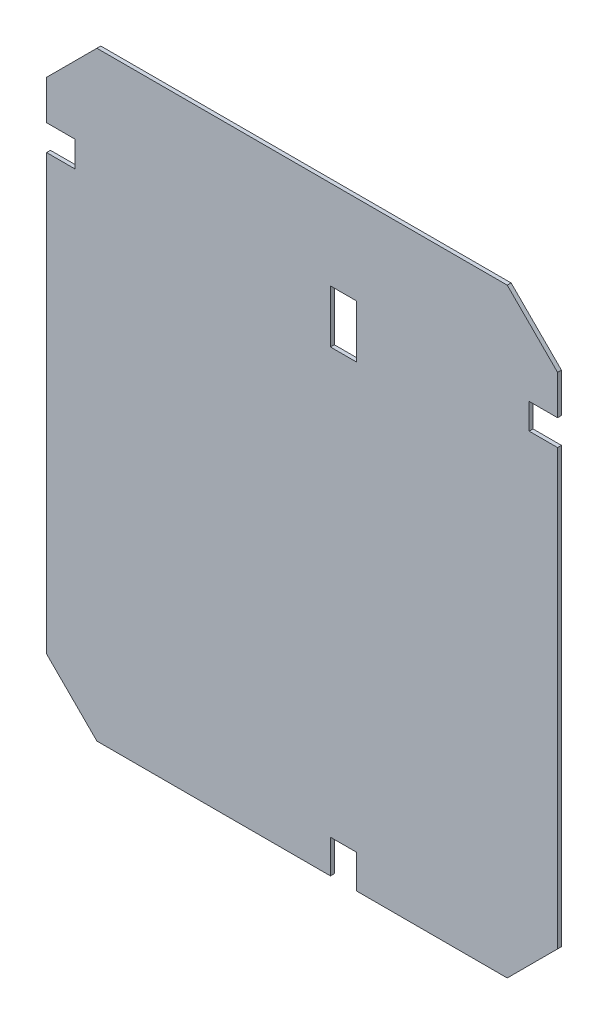
ISO-10303-21;
HEADER;
FILE_DESCRIPTION(('STEP AP214'),'2;1');
FILE_NAME('part.step','',(''),(''),'','','');
FILE_SCHEMA(('AUTOMOTIVE_DESIGN { 1 0 10303 214 1 1 1 1 }'));
ENDSEC;
DATA;
#1=APPLICATION_CONTEXT('core data for automotive mechanical design processes');
#2=APPLICATION_PROTOCOL_DEFINITION('international standard','automotive_design',2000,#1);
#3=PRODUCT_CONTEXT('',#1,'mechanical');
#4=PRODUCT('Part','Part','',(#3));
#5=PRODUCT_RELATED_PRODUCT_CATEGORY('part','',(#4));
#6=PRODUCT_DEFINITION_FORMATION('','',#4);
#7=PRODUCT_DEFINITION_CONTEXT('part definition',#1,'design');
#8=PRODUCT_DEFINITION('design','',#6,#7);
#9=PRODUCT_DEFINITION_SHAPE('','',#8);
#10=(LENGTH_UNIT() NAMED_UNIT(*) SI_UNIT(.MILLI.,.METRE.));
#11=(NAMED_UNIT(*) PLANE_ANGLE_UNIT() SI_UNIT($,.RADIAN.));
#12=(NAMED_UNIT(*) SI_UNIT($,.STERADIAN.) SOLID_ANGLE_UNIT());
#13=UNCERTAINTY_MEASURE_WITH_UNIT(LENGTH_MEASURE(1.E-05),#10,'distance_accuracy_value','');
#14=(GEOMETRIC_REPRESENTATION_CONTEXT(3) GLOBAL_UNCERTAINTY_ASSIGNED_CONTEXT((#13)) GLOBAL_UNIT_ASSIGNED_CONTEXT((#10,
#11,#12)) REPRESENTATION_CONTEXT('',''));
#15=CARTESIAN_POINT('',(0.,0.,0.));
#16=DIRECTION('',(0.,0.,1.));
#17=DIRECTION('',(1.,0.,0.));
#18=AXIS2_PLACEMENT_3D('',#15,#16,#17);
#19=CARTESIAN_POINT('',(-198.,-232.5,3.));
#20=DIRECTION('',(1.,0.,0.));
#21=DIRECTION('',(0.,1.,0.));
#22=AXIS2_PLACEMENT_3D('',#19,#20,#21);
#23=PLANE('',#22);
#24=DIRECTION('',(0.,0.,-1.));
#25=VECTOR('',#24,1.);
#26=CARTESIAN_POINT('',(-198.,143.,3.));
#27=LINE('',#26,#25);
#28=CARTESIAN_POINT('',(-198.,143.,3.));
#29=VERTEX_POINT('',#28);
#30=CARTESIAN_POINT('',(-198.,143.,0.));
#31=VERTEX_POINT('',#30);
#32=EDGE_CURVE('E303',#29,#31,#27,.T.);
#33=ORIENTED_EDGE('',*,*,#32,.T.);
#34=DIRECTION('',(0.,-1.,0.));
#35=VECTOR('',#34,1.);
#36=CARTESIAN_POINT('',(-198.,-232.5,0.));
#37=LINE('',#36,#35);
#38=CARTESIAN_POINT('',(-198.,-193.5,0.));
#39=VERTEX_POINT('',#38);
#40=EDGE_CURVE('E223',#31,#39,#37,.T.);
#41=ORIENTED_EDGE('',*,*,#40,.T.);
#42=DIRECTION('',(0.,0.,1.));
#43=VECTOR('',#42,1.);
#44=CARTESIAN_POINT('',(-198.,-193.5,3.));
#45=LINE('',#44,#43);
#46=CARTESIAN_POINT('',(-198.,-193.5,3.));
#47=VERTEX_POINT('',#46);
#48=EDGE_CURVE('E11',#39,#47,#45,.T.);
#49=ORIENTED_EDGE('',*,*,#48,.T.);
#50=DIRECTION('',(0.,-1.,0.));
#51=VECTOR('',#50,1.);
#52=CARTESIAN_POINT('',(-198.,-232.5,3.));
#53=LINE('',#52,#51);
#54=EDGE_CURVE('E232',#29,#47,#53,.T.);
#55=ORIENTED_EDGE('',*,*,#54,.F.);
#56=EDGE_LOOP('',(#33,#41,#49,#55));
#57=FACE_BOUND('',#56,.T.);
#58=ADVANCED_FACE('F17',(#57),#23,.F.);
#59=DIRECTION('',(0.,0.,-1.));
#60=VECTOR('',#59,1.);
#61=CARTESIAN_POINT('',(-198.,163.,3.));
#62=LINE('',#61,#60);
#63=CARTESIAN_POINT('',(-198.,163.,3.));
#64=VERTEX_POINT('',#63);
#65=CARTESIAN_POINT('',(-198.,163.,0.));
#66=VERTEX_POINT('',#65);
#67=EDGE_CURVE('E296',#64,#66,#62,.T.);
#68=ORIENTED_EDGE('',*,*,#67,.F.);
#69=CARTESIAN_POINT('',(-198.,193.5,3.));
#70=VERTEX_POINT('',#69);
#71=EDGE_CURVE('E210',#70,#64,#53,.T.);
#72=ORIENTED_EDGE('',*,*,#71,.F.);
#73=DIRECTION('',(0.,0.,-1.));
#74=VECTOR('',#73,1.);
#75=CARTESIAN_POINT('',(-198.,193.5,3.));
#76=LINE('',#75,#74);
#77=CARTESIAN_POINT('',(-198.,193.5,0.));
#78=VERTEX_POINT('',#77);
#79=EDGE_CURVE('E26',#70,#78,#76,.T.);
#80=ORIENTED_EDGE('',*,*,#79,.T.);
#81=EDGE_CURVE('E219',#78,#66,#37,.T.);
#82=ORIENTED_EDGE('',*,*,#81,.T.);
#83=EDGE_LOOP('',(#68,#72,#80,#82));
#84=FACE_BOUND('',#83,.T.);
#85=ADVANCED_FACE('F271',(#84),#23,.F.);
#86=CARTESIAN_POINT('',(198.,-232.5,3.));
#87=DIRECTION('',(0.,1.,0.));
#88=DIRECTION('',(-1.,0.,0.));
#89=AXIS2_PLACEMENT_3D('',#86,#87,#88);
#90=PLANE('',#89);
#91=DIRECTION('',(0.,0.,-1.));
#92=VECTOR('',#91,1.);
#93=CARTESIAN_POINT('',(22.,-232.5,3.));
#94=LINE('',#93,#92);
#95=CARTESIAN_POINT('',(22.,-232.5,3.));
#96=VERTEX_POINT('',#95);
#97=CARTESIAN_POINT('',(22.,-232.5,0.));
#98=VERTEX_POINT('',#97);
#99=EDGE_CURVE('E181',#96,#98,#94,.T.);
#100=ORIENTED_EDGE('',*,*,#99,.F.);
#101=DIRECTION('',(1.,0.,0.));
#102=VECTOR('',#101,1.);
#103=CARTESIAN_POINT('',(198.,-232.5,3.));
#104=LINE('',#103,#102);
#105=CARTESIAN_POINT('',(-159.,-232.5,3.));
#106=VERTEX_POINT('',#105);
#107=EDGE_CURVE('E194',#106,#96,#104,.T.);
#108=ORIENTED_EDGE('',*,*,#107,.F.);
#109=DIRECTION('',(0.,0.,-1.));
#110=VECTOR('',#109,1.);
#111=CARTESIAN_POINT('',(-159.,-232.5,3.));
#112=LINE('',#111,#110);
#113=CARTESIAN_POINT('',(-159.,-232.5,0.));
#114=VERTEX_POINT('',#113);
#115=EDGE_CURVE('E249',#106,#114,#112,.T.);
#116=ORIENTED_EDGE('',*,*,#115,.T.);
#117=DIRECTION('',(1.,0.,0.));
#118=VECTOR('',#117,1.);
#119=CARTESIAN_POINT('',(198.,-232.5,0.));
#120=LINE('',#119,#118);
#121=EDGE_CURVE('E197',#114,#98,#120,.T.);
#122=ORIENTED_EDGE('',*,*,#121,.T.);
#123=EDGE_LOOP('',(#100,#108,#116,#122));
#124=FACE_BOUND('',#123,.T.);
#125=ADVANCED_FACE('F192',(#124),#90,.F.);
#126=DIRECTION('',(0.,0.,-1.));
#127=VECTOR('',#126,1.);
#128=CARTESIAN_POINT('',(42.,-232.5,3.));
#129=LINE('',#128,#127);
#130=CARTESIAN_POINT('',(42.,-232.5,3.));
#131=VERTEX_POINT('',#130);
#132=CARTESIAN_POINT('',(42.,-232.5,0.));
#133=VERTEX_POINT('',#132);
#134=EDGE_CURVE('E199',#131,#133,#129,.T.);
#135=ORIENTED_EDGE('',*,*,#134,.T.);
#136=CARTESIAN_POINT('',(159.,-232.5,0.));
#137=VERTEX_POINT('',#136);
#138=EDGE_CURVE('E222',#133,#137,#120,.T.);
#139=ORIENTED_EDGE('',*,*,#138,.T.);
#140=DIRECTION('',(0.,0.,1.));
#141=VECTOR('',#140,1.);
#142=CARTESIAN_POINT('',(159.,-232.5,3.));
#143=LINE('',#142,#141);
#144=CARTESIAN_POINT('',(159.,-232.5,3.));
#145=VERTEX_POINT('',#144);
#146=EDGE_CURVE('E251',#137,#145,#143,.T.);
#147=ORIENTED_EDGE('',*,*,#146,.T.);
#148=EDGE_CURVE('E206',#131,#145,#104,.T.);
#149=ORIENTED_EDGE('',*,*,#148,.F.);
#150=EDGE_LOOP('',(#135,#139,#147,#149));
#151=FACE_BOUND('',#150,.T.);
#152=ADVANCED_FACE('F470',(#151),#90,.F.);
#153=CARTESIAN_POINT('',(198.,-232.5,3.));
#154=DIRECTION('',(-1.,0.,0.));
#155=DIRECTION('',(0.,0.,1.));
#156=AXIS2_PLACEMENT_3D('',#153,#154,#155);
#157=PLANE('',#156);
#158=DIRECTION('',(0.,0.,-1.));
#159=VECTOR('',#158,1.);
#160=CARTESIAN_POINT('',(198.,163.,3.));
#161=LINE('',#160,#159);
#162=CARTESIAN_POINT('',(198.,163.,3.));
#163=VERTEX_POINT('',#162);
#164=CARTESIAN_POINT('',(198.,163.,0.));
#165=VERTEX_POINT('',#164);
#166=EDGE_CURVE('E313',#163,#165,#161,.T.);
#167=ORIENTED_EDGE('',*,*,#166,.T.);
#168=DIRECTION('',(0.,1.,0.));
#169=VECTOR('',#168,1.);
#170=CARTESIAN_POINT('',(198.,-232.5,0.));
#171=LINE('',#170,#169);
#172=CARTESIAN_POINT('',(198.,193.5,0.));
#173=VERTEX_POINT('',#172);
#174=EDGE_CURVE('E225',#165,#173,#171,.T.);
#175=ORIENTED_EDGE('',*,*,#174,.T.);
#176=DIRECTION('',(0.,0.,1.));
#177=VECTOR('',#176,1.);
#178=CARTESIAN_POINT('',(198.,193.5,3.));
#179=LINE('',#178,#177);
#180=CARTESIAN_POINT('',(198.,193.5,3.));
#181=VERTEX_POINT('',#180);
#182=EDGE_CURVE('E218',#173,#181,#179,.T.);
#183=ORIENTED_EDGE('',*,*,#182,.T.);
#184=DIRECTION('',(0.,1.,0.));
#185=VECTOR('',#184,1.);
#186=CARTESIAN_POINT('',(198.,-232.5,3.));
#187=LINE('',#186,#185);
#188=EDGE_CURVE('E205',#163,#181,#187,.T.);
#189=ORIENTED_EDGE('',*,*,#188,.F.);
#190=EDGE_LOOP('',(#167,#175,#183,#189));
#191=FACE_BOUND('',#190,.T.);
#192=ADVANCED_FACE('F432',(#191),#157,.F.);
#193=DIRECTION('',(0.,0.,-1.));
#194=VECTOR('',#193,1.);
#195=CARTESIAN_POINT('',(198.,143.,3.));
#196=LINE('',#195,#194);
#197=CARTESIAN_POINT('',(198.,143.,3.));
#198=VERTEX_POINT('',#197);
#199=CARTESIAN_POINT('',(198.,143.,0.));
#200=VERTEX_POINT('',#199);
#201=EDGE_CURVE('E323',#198,#200,#196,.T.);
#202=ORIENTED_EDGE('',*,*,#201,.F.);
#203=CARTESIAN_POINT('',(198.,-193.5,3.));
#204=VERTEX_POINT('',#203);
#205=EDGE_CURVE('E208',#204,#198,#187,.T.);
#206=ORIENTED_EDGE('',*,*,#205,.F.);
#207=DIRECTION('',(0.,0.,-1.));
#208=VECTOR('',#207,1.);
#209=CARTESIAN_POINT('',(198.,-193.5,3.));
#210=LINE('',#209,#208);
#211=CARTESIAN_POINT('',(198.,-193.5,0.));
#212=VERTEX_POINT('',#211);
#213=EDGE_CURVE('E235',#204,#212,#210,.T.);
#214=ORIENTED_EDGE('',*,*,#213,.T.);
#215=EDGE_CURVE('E226',#212,#200,#171,.T.);
#216=ORIENTED_EDGE('',*,*,#215,.T.);
#217=EDGE_LOOP('',(#202,#206,#214,#216));
#218=FACE_BOUND('',#217,.T.);
#219=ADVANCED_FACE('F417',(#218),#157,.F.);
#220=CARTESIAN_POINT('',(0.,0.,3.));
#221=DIRECTION('',(0.,0.,1.));
#222=DIRECTION('',(1.,0.,0.));
#223=AXIS2_PLACEMENT_3D('',#220,#221,#222);
#224=PLANE('',#223);
#225=DIRECTION('',(1.,0.,0.));
#226=VECTOR('',#225,1.);
#227=CARTESIAN_POINT('',(22.,122.5,3.));
#228=LINE('',#227,#226);
#229=CARTESIAN_POINT('',(22.,122.5,3.));
#230=VERTEX_POINT('',#229);
#231=CARTESIAN_POINT('',(42.,122.5,3.));
#232=VERTEX_POINT('',#231);
#233=EDGE_CURVE('E332',#230,#232,#228,.T.);
#234=ORIENTED_EDGE('',*,*,#233,.F.);
#235=DIRECTION('',(0.,-1.,0.));
#236=VECTOR('',#235,1.);
#237=CARTESIAN_POINT('',(22.,163.5,3.));
#238=LINE('',#237,#236);
#239=CARTESIAN_POINT('',(22.,163.5,3.));
#240=VERTEX_POINT('',#239);
#241=EDGE_CURVE('E330',#240,#230,#238,.T.);
#242=ORIENTED_EDGE('',*,*,#241,.F.);
#243=DIRECTION('',(-1.,0.,0.));
#244=VECTOR('',#243,1.);
#245=CARTESIAN_POINT('',(22.,163.5,3.));
#246=LINE('',#245,#244);
#247=CARTESIAN_POINT('',(42.,163.5,3.));
#248=VERTEX_POINT('',#247);
#249=EDGE_CURVE('E337',#248,#240,#246,.T.);
#250=ORIENTED_EDGE('',*,*,#249,.F.);
#251=DIRECTION('',(0.,1.,0.));
#252=VECTOR('',#251,1.);
#253=CARTESIAN_POINT('',(42.,163.5,3.));
#254=LINE('',#253,#252);
#255=EDGE_CURVE('E335',#232,#248,#254,.T.);
#256=ORIENTED_EDGE('',*,*,#255,.F.);
#257=EDGE_LOOP('',(#234,#242,#250,#256));
#258=FACE_BOUND('',#257,.T.);
#259=DIRECTION('',(0.,-1.,0.));
#260=VECTOR('',#259,1.);
#261=CARTESIAN_POINT('',(176.,163.,3.));
#262=LINE('',#261,#260);
#263=CARTESIAN_POINT('',(176.,163.,3.));
#264=VERTEX_POINT('',#263);
#265=CARTESIAN_POINT('',(176.,143.,3.));
#266=VERTEX_POINT('',#265);
#267=EDGE_CURVE('E308',#264,#266,#262,.T.);
#268=ORIENTED_EDGE('',*,*,#267,.F.);
#269=DIRECTION('',(-1.,0.,0.));
#270=VECTOR('',#269,1.);
#271=CARTESIAN_POINT('',(198.,163.,3.));
#272=LINE('',#271,#270);
#273=EDGE_CURVE('E306',#163,#264,#272,.T.);
#274=ORIENTED_EDGE('',*,*,#273,.F.);
#275=ORIENTED_EDGE('',*,*,#188,.T.);
#276=DIRECTION('',(0.707106781186546,-0.707106781186549,0.));
#277=VECTOR('',#276,1.);
#278=CARTESIAN_POINT('',(195.75,195.75,3.));
#279=LINE('',#278,#277);
#280=CARTESIAN_POINT('',(159.,232.5,3.));
#281=VERTEX_POINT('',#280);
#282=EDGE_CURVE('E257',#181,#281,#279,.F.);
#283=ORIENTED_EDGE('',*,*,#282,.T.);
#284=DIRECTION('',(-1.,0.,0.));
#285=VECTOR('',#284,1.);
#286=CARTESIAN_POINT('',(198.,232.5,3.));
#287=LINE('',#286,#285);
#288=CARTESIAN_POINT('',(-159.,232.5,3.));
#289=VERTEX_POINT('',#288);
#290=EDGE_CURVE('E215',#281,#289,#287,.T.);
#291=ORIENTED_EDGE('',*,*,#290,.T.);
#292=DIRECTION('',(0.707106781186549,0.707106781186546,0.));
#293=VECTOR('',#292,1.);
#294=CARTESIAN_POINT('',(-195.75,195.75,3.));
#295=LINE('',#294,#293);
#296=EDGE_CURVE('E254',#289,#70,#295,.F.);
#297=ORIENTED_EDGE('',*,*,#296,.T.);
#298=ORIENTED_EDGE('',*,*,#71,.T.);
#299=DIRECTION('',(-1.,0.,0.));
#300=VECTOR('',#299,1.);
#301=CARTESIAN_POINT('',(-198.,163.,3.));
#302=LINE('',#301,#300);
#303=CARTESIAN_POINT('',(-176.,163.,3.));
#304=VERTEX_POINT('',#303);
#305=EDGE_CURVE('E299',#304,#64,#302,.T.);
#306=ORIENTED_EDGE('',*,*,#305,.F.);
#307=DIRECTION('',(0.,1.,0.));
#308=VECTOR('',#307,1.);
#309=CARTESIAN_POINT('',(-176.,163.,3.));
#310=LINE('',#309,#308);
#311=CARTESIAN_POINT('',(-176.,143.,3.));
#312=VERTEX_POINT('',#311);
#313=EDGE_CURVE('E290',#312,#304,#310,.T.);
#314=ORIENTED_EDGE('',*,*,#313,.F.);
#315=DIRECTION('',(1.,0.,0.));
#316=VECTOR('',#315,1.);
#317=CARTESIAN_POINT('',(-198.,143.,3.));
#318=LINE('',#317,#316);
#319=EDGE_CURVE('E288',#29,#312,#318,.T.);
#320=ORIENTED_EDGE('',*,*,#319,.F.);
#321=ORIENTED_EDGE('',*,*,#54,.T.);
#322=DIRECTION('',(-0.707106781186546,0.707106781186549,0.));
#323=VECTOR('',#322,1.);
#324=CARTESIAN_POINT('',(-195.75,-195.75,3.));
#325=LINE('',#324,#323);
#326=EDGE_CURVE('E204',#47,#106,#325,.F.);
#327=ORIENTED_EDGE('',*,*,#326,.T.);
#328=ORIENTED_EDGE('',*,*,#107,.T.);
#329=DIRECTION('',(0.,-1.,0.));
#330=VECTOR('',#329,1.);
#331=CARTESIAN_POINT('',(22.,-232.5,3.));
#332=LINE('',#331,#330);
#333=CARTESIAN_POINT('',(22.,-206.5,3.));
#334=VERTEX_POINT('',#333);
#335=EDGE_CURVE('E178',#334,#96,#332,.T.);
#336=ORIENTED_EDGE('',*,*,#335,.F.);
#337=DIRECTION('',(-1.,0.,0.));
#338=VECTOR('',#337,1.);
#339=CARTESIAN_POINT('',(22.,-206.5,3.));
#340=LINE('',#339,#338);
#341=CARTESIAN_POINT('',(42.,-206.5,3.));
#342=VERTEX_POINT('',#341);
#343=EDGE_CURVE('E454',#342,#334,#340,.T.);
#344=ORIENTED_EDGE('',*,*,#343,.F.);
#345=DIRECTION('',(0.,1.,0.));
#346=VECTOR('',#345,1.);
#347=CARTESIAN_POINT('',(42.,-232.5,3.));
#348=LINE('',#347,#346);
#349=EDGE_CURVE('E186',#131,#342,#348,.T.);
#350=ORIENTED_EDGE('',*,*,#349,.F.);
#351=ORIENTED_EDGE('',*,*,#148,.T.);
#352=DIRECTION('',(-0.707106781186549,-0.707106781186546,0.));
#353=VECTOR('',#352,1.);
#354=CARTESIAN_POINT('',(195.75,-195.75,3.));
#355=LINE('',#354,#353);
#356=EDGE_CURVE('E259',#145,#204,#355,.F.);
#357=ORIENTED_EDGE('',*,*,#356,.T.);
#358=ORIENTED_EDGE('',*,*,#205,.T.);
#359=DIRECTION('',(1.,0.,0.));
#360=VECTOR('',#359,1.);
#361=CARTESIAN_POINT('',(198.,143.,3.));
#362=LINE('',#361,#360);
#363=EDGE_CURVE('E311',#266,#198,#362,.T.);
#364=ORIENTED_EDGE('',*,*,#363,.F.);
#365=EDGE_LOOP('',(#268,#274,#275,#283,#291,#297,#298,#306,#314,#320,#321,#327,#328,#336,#344,
#350,#351,#357,#358,#364));
#366=FACE_BOUND('',#365,.T.);
#367=ADVANCED_FACE('F202',(#258,#366),#224,.T.);
#368=CARTESIAN_POINT('',(0.,0.,0.));
#369=DIRECTION('',(0.,0.,1.));
#370=DIRECTION('',(1.,0.,0.));
#371=AXIS2_PLACEMENT_3D('',#368,#369,#370);
#372=PLANE('',#371);
#373=DIRECTION('',(0.,-1.,0.));
#374=VECTOR('',#373,1.);
#375=CARTESIAN_POINT('',(22.,163.5,0.));
#376=LINE('',#375,#374);
#377=CARTESIAN_POINT('',(22.,163.5,0.));
#378=VERTEX_POINT('',#377);
#379=CARTESIAN_POINT('',(22.,122.5,0.));
#380=VERTEX_POINT('',#379);
#381=EDGE_CURVE('E198',#378,#380,#376,.T.);
#382=ORIENTED_EDGE('',*,*,#381,.T.);
#383=DIRECTION('',(1.,0.,0.));
#384=VECTOR('',#383,1.);
#385=CARTESIAN_POINT('',(22.,122.5,0.));
#386=LINE('',#385,#384);
#387=CARTESIAN_POINT('',(42.,122.5,0.));
#388=VERTEX_POINT('',#387);
#389=EDGE_CURVE('E342',#380,#388,#386,.T.);
#390=ORIENTED_EDGE('',*,*,#389,.T.);
#391=DIRECTION('',(0.,1.,0.));
#392=VECTOR('',#391,1.);
#393=CARTESIAN_POINT('',(42.,163.5,0.));
#394=LINE('',#393,#392);
#395=CARTESIAN_POINT('',(42.,163.5,0.));
#396=VERTEX_POINT('',#395);
#397=EDGE_CURVE('E345',#388,#396,#394,.T.);
#398=ORIENTED_EDGE('',*,*,#397,.T.);
#399=DIRECTION('',(-1.,0.,0.));
#400=VECTOR('',#399,1.);
#401=CARTESIAN_POINT('',(22.,163.5,0.));
#402=LINE('',#401,#400);
#403=EDGE_CURVE('E333',#396,#378,#402,.T.);
#404=ORIENTED_EDGE('',*,*,#403,.T.);
#405=EDGE_LOOP('',(#382,#390,#398,#404));
#406=FACE_BOUND('',#405,.T.);
#407=DIRECTION('',(-1.,0.,0.));
#408=VECTOR('',#407,1.);
#409=CARTESIAN_POINT('',(198.,163.,0.));
#410=LINE('',#409,#408);
#411=CARTESIAN_POINT('',(176.,163.,0.));
#412=VERTEX_POINT('',#411);
#413=EDGE_CURVE('E314',#165,#412,#410,.T.);
#414=ORIENTED_EDGE('',*,*,#413,.T.);
#415=DIRECTION('',(0.,-1.,0.));
#416=VECTOR('',#415,1.);
#417=CARTESIAN_POINT('',(176.,163.,0.));
#418=LINE('',#417,#416);
#419=CARTESIAN_POINT('',(176.,143.,0.));
#420=VERTEX_POINT('',#419);
#421=EDGE_CURVE('E316',#412,#420,#418,.T.);
#422=ORIENTED_EDGE('',*,*,#421,.T.);
#423=DIRECTION('',(1.,0.,0.));
#424=VECTOR('',#423,1.);
#425=CARTESIAN_POINT('',(198.,143.,0.));
#426=LINE('',#425,#424);
#427=EDGE_CURVE('E309',#420,#200,#426,.T.);
#428=ORIENTED_EDGE('',*,*,#427,.T.);
#429=ORIENTED_EDGE('',*,*,#215,.F.);
#430=DIRECTION('',(0.707106781186549,0.707106781186546,0.));
#431=VECTOR('',#430,1.);
#432=CARTESIAN_POINT('',(198.,-193.5,0.));
#433=LINE('',#432,#431);
#434=EDGE_CURVE('E246',#212,#137,#433,.F.);
#435=ORIENTED_EDGE('',*,*,#434,.T.);
#436=ORIENTED_EDGE('',*,*,#138,.F.);
#437=DIRECTION('',(0.,1.,0.));
#438=VECTOR('',#437,1.);
#439=CARTESIAN_POINT('',(42.,-232.5,0.));
#440=LINE('',#439,#438);
#441=CARTESIAN_POINT('',(42.,-206.5,0.));
#442=VERTEX_POINT('',#441);
#443=EDGE_CURVE('E457',#133,#442,#440,.T.);
#444=ORIENTED_EDGE('',*,*,#443,.T.);
#445=DIRECTION('',(-1.,0.,0.));
#446=VECTOR('',#445,1.);
#447=CARTESIAN_POINT('',(22.,-206.5,0.));
#448=LINE('',#447,#446);
#449=CARTESIAN_POINT('',(22.,-206.5,0.));
#450=VERTEX_POINT('',#449);
#451=EDGE_CURVE('E187',#442,#450,#448,.T.);
#452=ORIENTED_EDGE('',*,*,#451,.T.);
#453=DIRECTION('',(0.,-1.,0.));
#454=VECTOR('',#453,1.);
#455=CARTESIAN_POINT('',(22.,-232.5,0.));
#456=LINE('',#455,#454);
#457=EDGE_CURVE('E41',#450,#98,#456,.T.);
#458=ORIENTED_EDGE('',*,*,#457,.T.);
#459=ORIENTED_EDGE('',*,*,#121,.F.);
#460=DIRECTION('',(0.707106781186546,-0.707106781186549,0.));
#461=VECTOR('',#460,1.);
#462=CARTESIAN_POINT('',(-159.,-232.5,0.));
#463=LINE('',#462,#461);
#464=EDGE_CURVE('E240',#114,#39,#463,.F.);
#465=ORIENTED_EDGE('',*,*,#464,.T.);
#466=ORIENTED_EDGE('',*,*,#40,.F.);
#467=DIRECTION('',(1.,0.,0.));
#468=VECTOR('',#467,1.);
#469=CARTESIAN_POINT('',(-198.,143.,0.));
#470=LINE('',#469,#468);
#471=CARTESIAN_POINT('',(-176.,143.,0.));
#472=VERTEX_POINT('',#471);
#473=EDGE_CURVE('E292',#31,#472,#470,.T.);
#474=ORIENTED_EDGE('',*,*,#473,.T.);
#475=DIRECTION('',(0.,1.,0.));
#476=VECTOR('',#475,1.);
#477=CARTESIAN_POINT('',(-176.,163.,0.));
#478=LINE('',#477,#476);
#479=CARTESIAN_POINT('',(-176.,163.,0.));
#480=VERTEX_POINT('',#479);
#481=EDGE_CURVE('E285',#472,#480,#478,.T.);
#482=ORIENTED_EDGE('',*,*,#481,.T.);
#483=DIRECTION('',(-1.,0.,0.));
#484=VECTOR('',#483,1.);
#485=CARTESIAN_POINT('',(-198.,163.,0.));
#486=LINE('',#485,#484);
#487=EDGE_CURVE('E282',#480,#66,#486,.T.);
#488=ORIENTED_EDGE('',*,*,#487,.T.);
#489=ORIENTED_EDGE('',*,*,#81,.F.);
#490=DIRECTION('',(-0.707106781186549,-0.707106781186546,0.));
#491=VECTOR('',#490,1.);
#492=CARTESIAN_POINT('',(-198.,193.5,0.));
#493=LINE('',#492,#491);
#494=CARTESIAN_POINT('',(-159.,232.5,0.));
#495=VERTEX_POINT('',#494);
#496=EDGE_CURVE('E238',#78,#495,#493,.F.);
#497=ORIENTED_EDGE('',*,*,#496,.T.);
#498=DIRECTION('',(-1.,0.,0.));
#499=VECTOR('',#498,1.);
#500=CARTESIAN_POINT('',(198.,232.5,0.));
#501=LINE('',#500,#499);
#502=CARTESIAN_POINT('',(159.,232.5,0.));
#503=VERTEX_POINT('',#502);
#504=EDGE_CURVE('E229',#503,#495,#501,.T.);
#505=ORIENTED_EDGE('',*,*,#504,.F.);
#506=DIRECTION('',(-0.707106781186546,0.707106781186549,0.));
#507=VECTOR('',#506,1.);
#508=CARTESIAN_POINT('',(159.,232.5,0.));
#509=LINE('',#508,#507);
#510=EDGE_CURVE('E243',#503,#173,#509,.F.);
#511=ORIENTED_EDGE('',*,*,#510,.T.);
#512=ORIENTED_EDGE('',*,*,#174,.F.);
#513=EDGE_LOOP('',(#414,#422,#428,#429,#435,#436,#444,#452,#458,#459,#465,#466,#474,#482,#488,
#489,#497,#505,#511,#512));
#514=FACE_BOUND('',#513,.T.);
#515=ADVANCED_FACE('F278',(#406,#514),#372,.F.);
#516=CARTESIAN_POINT('',(198.,232.5,3.));
#517=DIRECTION('',(0.,-1.,0.));
#518=DIRECTION('',(1.,0.,0.));
#519=AXIS2_PLACEMENT_3D('',#516,#517,#518);
#520=PLANE('',#519);
#521=ORIENTED_EDGE('',*,*,#290,.F.);
#522=DIRECTION('',(0.,0.,-1.));
#523=VECTOR('',#522,1.);
#524=CARTESIAN_POINT('',(159.,232.5,3.));
#525=LINE('',#524,#523);
#526=EDGE_CURVE('E263',#281,#503,#525,.T.);
#527=ORIENTED_EDGE('',*,*,#526,.T.);
#528=ORIENTED_EDGE('',*,*,#504,.T.);
#529=DIRECTION('',(0.,0.,1.));
#530=VECTOR('',#529,1.);
#531=CARTESIAN_POINT('',(-159.,232.5,3.));
#532=LINE('',#531,#530);
#533=EDGE_CURVE('E261',#495,#289,#532,.T.);
#534=ORIENTED_EDGE('',*,*,#533,.T.);
#535=EDGE_LOOP('',(#521,#527,#528,#534));
#536=FACE_BOUND('',#535,.T.);
#537=ADVANCED_FACE('F392',(#536),#520,.F.);
#538=CARTESIAN_POINT('',(198.,-193.5,3.));
#539=DIRECTION('',(-0.707106781186546,0.707106781186549,0.));
#540=DIRECTION('',(0.,0.,-1.));
#541=AXIS2_PLACEMENT_3D('',#538,#539,#540);
#542=PLANE('',#541);
#543=ORIENTED_EDGE('',*,*,#356,.F.);
#544=ORIENTED_EDGE('',*,*,#146,.F.);
#545=ORIENTED_EDGE('',*,*,#434,.F.);
#546=ORIENTED_EDGE('',*,*,#213,.F.);
#547=EDGE_LOOP('',(#543,#544,#545,#546));
#548=FACE_BOUND('',#547,.T.);
#549=ADVANCED_FACE('F373',(#548),#542,.F.);
#550=CARTESIAN_POINT('',(159.,232.5,3.));
#551=DIRECTION('',(-0.707106781186549,-0.707106781186546,0.));
#552=DIRECTION('',(0.,0.,-1.));
#553=AXIS2_PLACEMENT_3D('',#550,#551,#552);
#554=PLANE('',#553);
#555=ORIENTED_EDGE('',*,*,#282,.F.);
#556=ORIENTED_EDGE('',*,*,#182,.F.);
#557=ORIENTED_EDGE('',*,*,#510,.F.);
#558=ORIENTED_EDGE('',*,*,#526,.F.);
#559=EDGE_LOOP('',(#555,#556,#557,#558));
#560=FACE_BOUND('',#559,.T.);
#561=ADVANCED_FACE('F365',(#560),#554,.F.);
#562=CARTESIAN_POINT('',(-159.,-232.5,3.));
#563=DIRECTION('',(0.707106781186549,0.707106781186546,0.));
#564=DIRECTION('',(0.,0.,-1.));
#565=AXIS2_PLACEMENT_3D('',#562,#563,#564);
#566=PLANE('',#565);
#567=ORIENTED_EDGE('',*,*,#326,.F.);
#568=ORIENTED_EDGE('',*,*,#48,.F.);
#569=ORIENTED_EDGE('',*,*,#464,.F.);
#570=ORIENTED_EDGE('',*,*,#115,.F.);
#571=EDGE_LOOP('',(#567,#568,#569,#570));
#572=FACE_BOUND('',#571,.T.);
#573=ADVANCED_FACE('F363',(#572),#566,.F.);
#574=CARTESIAN_POINT('',(-198.,193.5,3.));
#575=DIRECTION('',(0.707106781186546,-0.707106781186549,0.));
#576=DIRECTION('',(0.,0.,-1.));
#577=AXIS2_PLACEMENT_3D('',#574,#575,#576);
#578=PLANE('',#577);
#579=ORIENTED_EDGE('',*,*,#296,.F.);
#580=ORIENTED_EDGE('',*,*,#533,.F.);
#581=ORIENTED_EDGE('',*,*,#496,.F.);
#582=ORIENTED_EDGE('',*,*,#79,.F.);
#583=EDGE_LOOP('',(#579,#580,#581,#582));
#584=FACE_BOUND('',#583,.T.);
#585=ADVANCED_FACE('F20',(#584),#578,.F.);
#586=CARTESIAN_POINT('',(22.,163.5,3.));
#587=DIRECTION('',(1.,0.,0.));
#588=DIRECTION('',(0.,1.,0.));
#589=AXIS2_PLACEMENT_3D('',#586,#587,#588);
#590=PLANE('',#589);
#591=ORIENTED_EDGE('',*,*,#381,.F.);
#592=DIRECTION('',(0.,0.,-1.));
#593=VECTOR('',#592,1.);
#594=CARTESIAN_POINT('',(22.,163.5,3.));
#595=LINE('',#594,#593);
#596=EDGE_CURVE('E339',#240,#378,#595,.T.);
#597=ORIENTED_EDGE('',*,*,#596,.F.);
#598=ORIENTED_EDGE('',*,*,#241,.T.);
#599=DIRECTION('',(0.,0.,-1.));
#600=VECTOR('',#599,1.);
#601=CARTESIAN_POINT('',(22.,122.5,3.));
#602=LINE('',#601,#600);
#603=EDGE_CURVE('E354',#230,#380,#602,.T.);
#604=ORIENTED_EDGE('',*,*,#603,.T.);
#605=EDGE_LOOP('',(#591,#597,#598,#604));
#606=FACE_BOUND('',#605,.T.);
#607=ADVANCED_FACE('F372',(#606),#590,.T.);
#608=CARTESIAN_POINT('',(22.,122.5,3.));
#609=DIRECTION('',(0.,1.,0.));
#610=DIRECTION('',(0.,0.,1.));
#611=AXIS2_PLACEMENT_3D('',#608,#609,#610);
#612=PLANE('',#611);
#613=ORIENTED_EDGE('',*,*,#389,.F.);
#614=ORIENTED_EDGE('',*,*,#603,.F.);
#615=ORIENTED_EDGE('',*,*,#233,.T.);
#616=DIRECTION('',(0.,0.,-1.));
#617=VECTOR('',#616,1.);
#618=CARTESIAN_POINT('',(42.,122.5,3.));
#619=LINE('',#618,#617);
#620=EDGE_CURVE('E353',#232,#388,#619,.T.);
#621=ORIENTED_EDGE('',*,*,#620,.T.);
#622=EDGE_LOOP('',(#613,#614,#615,#621));
#623=FACE_BOUND('',#622,.T.);
#624=ADVANCED_FACE('F517',(#623),#612,.T.);
#625=CARTESIAN_POINT('',(42.,163.5,3.));
#626=DIRECTION('',(-1.,0.,0.));
#627=DIRECTION('',(0.,0.,1.));
#628=AXIS2_PLACEMENT_3D('',#625,#626,#627);
#629=PLANE('',#628);
#630=ORIENTED_EDGE('',*,*,#397,.F.);
#631=ORIENTED_EDGE('',*,*,#620,.F.);
#632=ORIENTED_EDGE('',*,*,#255,.T.);
#633=DIRECTION('',(0.,0.,-1.));
#634=VECTOR('',#633,1.);
#635=CARTESIAN_POINT('',(42.,163.5,3.));
#636=LINE('',#635,#634);
#637=EDGE_CURVE('E33',#248,#396,#636,.T.);
#638=ORIENTED_EDGE('',*,*,#637,.T.);
#639=EDGE_LOOP('',(#630,#631,#632,#638));
#640=FACE_BOUND('',#639,.T.);
#641=ADVANCED_FACE('F527',(#640),#629,.T.);
#642=CARTESIAN_POINT('',(22.,163.5,3.));
#643=DIRECTION('',(0.,-1.,0.));
#644=DIRECTION('',(0.,0.,-1.));
#645=AXIS2_PLACEMENT_3D('',#642,#643,#644);
#646=PLANE('',#645);
#647=ORIENTED_EDGE('',*,*,#403,.F.);
#648=ORIENTED_EDGE('',*,*,#637,.F.);
#649=ORIENTED_EDGE('',*,*,#249,.T.);
#650=ORIENTED_EDGE('',*,*,#596,.T.);
#651=EDGE_LOOP('',(#647,#648,#649,#650));
#652=FACE_BOUND('',#651,.T.);
#653=ADVANCED_FACE('F537',(#652),#646,.T.);
#654=CARTESIAN_POINT('',(22.,-232.5,3.));
#655=DIRECTION('',(1.,0.,0.));
#656=DIRECTION('',(0.,1.,0.));
#657=AXIS2_PLACEMENT_3D('',#654,#655,#656);
#658=PLANE('',#657);
#659=ORIENTED_EDGE('',*,*,#457,.F.);
#660=DIRECTION('',(0.,0.,-1.));
#661=VECTOR('',#660,1.);
#662=CARTESIAN_POINT('',(22.,-206.5,3.));
#663=LINE('',#662,#661);
#664=EDGE_CURVE('E182',#334,#450,#663,.T.);
#665=ORIENTED_EDGE('',*,*,#664,.F.);
#666=ORIENTED_EDGE('',*,*,#335,.T.);
#667=ORIENTED_EDGE('',*,*,#99,.T.);
#668=EDGE_LOOP('',(#659,#665,#666,#667));
#669=FACE_BOUND('',#668,.T.);
#670=ADVANCED_FACE('F180',(#669),#658,.T.);
#671=CARTESIAN_POINT('',(42.,-232.5,3.));
#672=DIRECTION('',(-1.,0.,0.));
#673=DIRECTION('',(0.,0.,1.));
#674=AXIS2_PLACEMENT_3D('',#671,#672,#673);
#675=PLANE('',#674);
#676=ORIENTED_EDGE('',*,*,#443,.F.);
#677=ORIENTED_EDGE('',*,*,#134,.F.);
#678=ORIENTED_EDGE('',*,*,#349,.T.);
#679=DIRECTION('',(0.,0.,-1.));
#680=VECTOR('',#679,1.);
#681=CARTESIAN_POINT('',(42.,-206.5,3.));
#682=LINE('',#681,#680);
#683=EDGE_CURVE('E451',#342,#442,#682,.T.);
#684=ORIENTED_EDGE('',*,*,#683,.T.);
#685=EDGE_LOOP('',(#676,#677,#678,#684));
#686=FACE_BOUND('',#685,.T.);
#687=ADVANCED_FACE('F464',(#686),#675,.T.);
#688=CARTESIAN_POINT('',(22.,-206.5,3.));
#689=DIRECTION('',(0.,-1.,0.));
#690=DIRECTION('',(0.,0.,-1.));
#691=AXIS2_PLACEMENT_3D('',#688,#689,#690);
#692=PLANE('',#691);
#693=ORIENTED_EDGE('',*,*,#451,.F.);
#694=ORIENTED_EDGE('',*,*,#683,.F.);
#695=ORIENTED_EDGE('',*,*,#343,.T.);
#696=ORIENTED_EDGE('',*,*,#664,.T.);
#697=EDGE_LOOP('',(#693,#694,#695,#696));
#698=FACE_BOUND('',#697,.T.);
#699=ADVANCED_FACE('F467',(#698),#692,.T.);
#700=CARTESIAN_POINT('',(-198.,143.,3.));
#701=DIRECTION('',(0.,1.,0.));
#702=DIRECTION('',(0.,0.,1.));
#703=AXIS2_PLACEMENT_3D('',#700,#701,#702);
#704=PLANE('',#703);
#705=ORIENTED_EDGE('',*,*,#473,.F.);
#706=ORIENTED_EDGE('',*,*,#32,.F.);
#707=ORIENTED_EDGE('',*,*,#319,.T.);
#708=DIRECTION('',(0.,0.,-1.));
#709=VECTOR('',#708,1.);
#710=CARTESIAN_POINT('',(-176.,143.,3.));
#711=LINE('',#710,#709);
#712=EDGE_CURVE('E301',#312,#472,#711,.T.);
#713=ORIENTED_EDGE('',*,*,#712,.T.);
#714=EDGE_LOOP('',(#705,#706,#707,#713));
#715=FACE_BOUND('',#714,.T.);
#716=ADVANCED_FACE('F443',(#715),#704,.T.);
#717=CARTESIAN_POINT('',(-176.,163.,3.));
#718=DIRECTION('',(-1.,0.,0.));
#719=DIRECTION('',(0.,0.,1.));
#720=AXIS2_PLACEMENT_3D('',#717,#718,#719);
#721=PLANE('',#720);
#722=ORIENTED_EDGE('',*,*,#481,.F.);
#723=ORIENTED_EDGE('',*,*,#712,.F.);
#724=ORIENTED_EDGE('',*,*,#313,.T.);
#725=DIRECTION('',(0.,0.,-1.));
#726=VECTOR('',#725,1.);
#727=CARTESIAN_POINT('',(-176.,163.,3.));
#728=LINE('',#727,#726);
#729=EDGE_CURVE('E298',#304,#480,#728,.T.);
#730=ORIENTED_EDGE('',*,*,#729,.T.);
#731=EDGE_LOOP('',(#722,#723,#724,#730));
#732=FACE_BOUND('',#731,.T.);
#733=ADVANCED_FACE('F445',(#732),#721,.T.);
#734=CARTESIAN_POINT('',(-198.,163.,3.));
#735=DIRECTION('',(0.,-1.,0.));
#736=DIRECTION('',(0.,0.,-1.));
#737=AXIS2_PLACEMENT_3D('',#734,#735,#736);
#738=PLANE('',#737);
#739=ORIENTED_EDGE('',*,*,#487,.F.);
#740=ORIENTED_EDGE('',*,*,#729,.F.);
#741=ORIENTED_EDGE('',*,*,#305,.T.);
#742=ORIENTED_EDGE('',*,*,#67,.T.);
#743=EDGE_LOOP('',(#739,#740,#741,#742));
#744=FACE_BOUND('',#743,.T.);
#745=ADVANCED_FACE('F587',(#744),#738,.T.);
#746=CARTESIAN_POINT('',(198.,163.,3.));
#747=DIRECTION('',(0.,-1.,0.));
#748=DIRECTION('',(0.,0.,-1.));
#749=AXIS2_PLACEMENT_3D('',#746,#747,#748);
#750=PLANE('',#749);
#751=ORIENTED_EDGE('',*,*,#413,.F.);
#752=ORIENTED_EDGE('',*,*,#166,.F.);
#753=ORIENTED_EDGE('',*,*,#273,.T.);
#754=DIRECTION('',(0.,0.,-1.));
#755=VECTOR('',#754,1.);
#756=CARTESIAN_POINT('',(176.,163.,3.));
#757=LINE('',#756,#755);
#758=EDGE_CURVE('E327',#264,#412,#757,.T.);
#759=ORIENTED_EDGE('',*,*,#758,.T.);
#760=EDGE_LOOP('',(#751,#752,#753,#759));
#761=FACE_BOUND('',#760,.T.);
#762=ADVANCED_FACE('F428',(#761),#750,.T.);
#763=CARTESIAN_POINT('',(176.,163.,3.));
#764=DIRECTION('',(1.,0.,0.));
#765=DIRECTION('',(0.,0.,-1.));
#766=AXIS2_PLACEMENT_3D('',#763,#764,#765);
#767=PLANE('',#766);
#768=ORIENTED_EDGE('',*,*,#421,.F.);
#769=ORIENTED_EDGE('',*,*,#758,.F.);
#770=ORIENTED_EDGE('',*,*,#267,.T.);
#771=DIRECTION('',(0.,0.,-1.));
#772=VECTOR('',#771,1.);
#773=CARTESIAN_POINT('',(176.,143.,3.));
#774=LINE('',#773,#772);
#775=EDGE_CURVE('E325',#266,#420,#774,.T.);
#776=ORIENTED_EDGE('',*,*,#775,.T.);
#777=EDGE_LOOP('',(#768,#769,#770,#776));
#778=FACE_BOUND('',#777,.T.);
#779=ADVANCED_FACE('F426',(#778),#767,.T.);
#780=CARTESIAN_POINT('',(198.,143.,3.));
#781=DIRECTION('',(0.,1.,0.));
#782=DIRECTION('',(0.,0.,1.));
#783=AXIS2_PLACEMENT_3D('',#780,#781,#782);
#784=PLANE('',#783);
#785=ORIENTED_EDGE('',*,*,#427,.F.);
#786=ORIENTED_EDGE('',*,*,#775,.F.);
#787=ORIENTED_EDGE('',*,*,#363,.T.);
#788=ORIENTED_EDGE('',*,*,#201,.T.);
#789=EDGE_LOOP('',(#785,#786,#787,#788));
#790=FACE_BOUND('',#789,.T.);
#791=ADVANCED_FACE('F421',(#790),#784,.T.);
#792=CLOSED_SHELL('',(#58,#85,#125,#152,#192,#219,#367,#515,#537,#549,#561,#573,#585,#607,#624,
#641,#653,#670,#687,#699,#716,#733,#745,#762,#779,#791));
#793=MANIFOLD_SOLID_BREP('B1',#792);
#794=ADVANCED_BREP_SHAPE_REPRESENTATION('',(#18,#793),#14);
#795=SHAPE_DEFINITION_REPRESENTATION(#9,#794);
ENDSEC;
END-ISO-10303-21;
